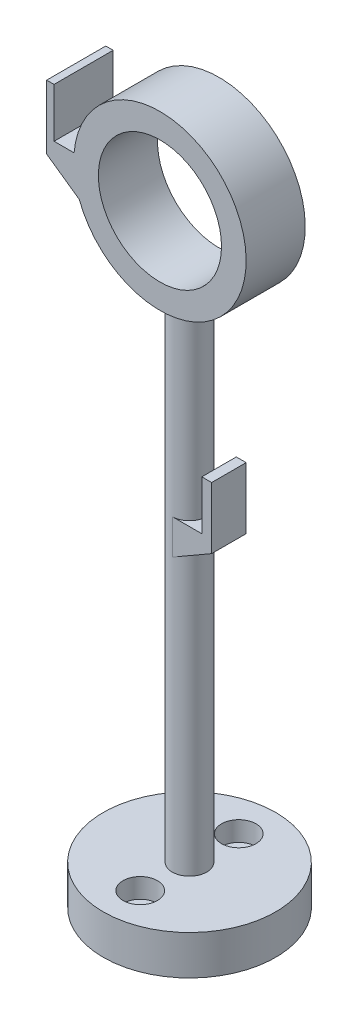
ISO-10303-21;
HEADER;
FILE_DESCRIPTION(('STEP AP214'),'2;1');
FILE_NAME('part.step','',(''),(''),'','','');
FILE_SCHEMA(('AUTOMOTIVE_DESIGN { 1 0 10303 214 1 1 1 1 }'));
ENDSEC;
DATA;
#1=APPLICATION_CONTEXT('core data for automotive mechanical design processes');
#2=APPLICATION_PROTOCOL_DEFINITION('international standard','automotive_design',2000,#1);
#3=PRODUCT_CONTEXT('',#1,'mechanical');
#4=PRODUCT('Part','Part','',(#3));
#5=PRODUCT_RELATED_PRODUCT_CATEGORY('part','',(#4));
#6=PRODUCT_DEFINITION_FORMATION('','',#4);
#7=PRODUCT_DEFINITION_CONTEXT('part definition',#1,'design');
#8=PRODUCT_DEFINITION('design','',#6,#7);
#9=PRODUCT_DEFINITION_SHAPE('','',#8);
#10=(LENGTH_UNIT() NAMED_UNIT(*) SI_UNIT(.MILLI.,.METRE.));
#11=(NAMED_UNIT(*) PLANE_ANGLE_UNIT() SI_UNIT($,.RADIAN.));
#12=(NAMED_UNIT(*) SI_UNIT($,.STERADIAN.) SOLID_ANGLE_UNIT());
#13=UNCERTAINTY_MEASURE_WITH_UNIT(LENGTH_MEASURE(1.E-05),#10,'distance_accuracy_value','');
#14=(GEOMETRIC_REPRESENTATION_CONTEXT(3) GLOBAL_UNCERTAINTY_ASSIGNED_CONTEXT((#13)) GLOBAL_UNIT_ASSIGNED_CONTEXT((#10,
#11,#12)) REPRESENTATION_CONTEXT('',''));
#15=CARTESIAN_POINT('',(0.,0.,0.));
#16=DIRECTION('',(0.,0.,1.));
#17=DIRECTION('',(1.,0.,0.));
#18=AXIS2_PLACEMENT_3D('',#15,#16,#17);
#19=CARTESIAN_POINT('',(0.,125.5,6.));
#20=DIRECTION('',(0.,0.,-1.));
#21=DIRECTION('',(-1.,0.,0.));
#22=AXIS2_PLACEMENT_3D('',#19,#20,#21);
#23=CYLINDRICAL_SURFACE('',#22,17.5);
#24=DIRECTION('',(0.,0.,-1.));
#25=VECTOR('',#24,1.);
#26=CARTESIAN_POINT('',(-16.3785413024095,119.33612258353,6.));
#27=LINE('',#26,#25);
#28=CARTESIAN_POINT('',(-16.3785413024095,119.33612258353,6.));
#29=VERTEX_POINT('',#28);
#30=CARTESIAN_POINT('',(-16.3785413024095,119.33612258353,-6.));
#31=VERTEX_POINT('',#30);
#32=EDGE_CURVE('E104',#29,#31,#27,.T.);
#33=ORIENTED_EDGE('',*,*,#32,.T.);
#34=CARTESIAN_POINT('',(0.,125.5,-6.));
#35=DIRECTION('',(0.,0.,1.));
#36=DIRECTION('',(1.,0.,0.));
#37=AXIS2_PLACEMENT_3D('',#34,#35,#36);
#38=CIRCLE('',#37,17.5);
#39=CARTESIAN_POINT('',(-17.4355957741627,127.,-6.));
#40=VERTEX_POINT('',#39);
#41=EDGE_CURVE('E57',#31,#40,#38,.T.);
#42=ORIENTED_EDGE('',*,*,#41,.T.);
#43=DIRECTION('',(0.,0.,-1.));
#44=VECTOR('',#43,1.);
#45=CARTESIAN_POINT('',(-17.4355957741627,127.,6.));
#46=LINE('',#45,#44);
#47=CARTESIAN_POINT('',(-17.4355957741627,127.,6.));
#48=VERTEX_POINT('',#47);
#49=EDGE_CURVE('E12',#48,#40,#46,.T.);
#50=ORIENTED_EDGE('',*,*,#49,.F.);
#51=CARTESIAN_POINT('',(0.,125.5,6.));
#52=DIRECTION('',(0.,0.,1.));
#53=DIRECTION('',(1.,0.,0.));
#54=AXIS2_PLACEMENT_3D('',#51,#52,#53);
#55=CIRCLE('',#54,17.5);
#56=EDGE_CURVE('E50',#29,#48,#55,.T.);
#57=ORIENTED_EDGE('',*,*,#56,.F.);
#58=EDGE_LOOP('',(#33,#42,#50,#57));
#59=FACE_BOUND('',#58,.T.);
#60=ADVANCED_FACE('F43',(#59),#23,.T.);
#61=CARTESIAN_POINT('',(-23.,127.,-6.00000000000016));
#62=DIRECTION('',(0.,-1.,0.));
#63=DIRECTION('',(0.,0.,-1.));
#64=AXIS2_PLACEMENT_3D('',#61,#62,#63);
#65=PLANE('',#64);
#66=DIRECTION('',(0.,0.,-1.));
#67=VECTOR('',#66,1.);
#68=CARTESIAN_POINT('',(-21.5,127.,-6.00000000000016));
#69=LINE('',#68,#67);
#70=CARTESIAN_POINT('',(-21.5,127.,5.99999999999984));
#71=VERTEX_POINT('',#70);
#72=CARTESIAN_POINT('',(-21.5,127.,-6.00000000000016));
#73=VERTEX_POINT('',#72);
#74=EDGE_CURVE('E108',#71,#73,#69,.T.);
#75=ORIENTED_EDGE('',*,*,#74,.F.);
#76=DIRECTION('',(1.,0.,0.));
#77=VECTOR('',#76,1.);
#78=CARTESIAN_POINT('',(-23.,127.,5.99999999999984));
#79=LINE('',#78,#77);
#80=EDGE_CURVE('E116',#71,#48,#79,.T.);
#81=ORIENTED_EDGE('',*,*,#80,.T.);
#82=ORIENTED_EDGE('',*,*,#49,.T.);
#83=DIRECTION('',(1.,0.,0.));
#84=VECTOR('',#83,1.);
#85=CARTESIAN_POINT('',(-23.,127.,-6.00000000000016));
#86=LINE('',#85,#84);
#87=EDGE_CURVE('E120',#73,#40,#86,.T.);
#88=ORIENTED_EDGE('',*,*,#87,.F.);
#89=EDGE_LOOP('',(#75,#81,#82,#88));
#90=FACE_BOUND('',#89,.T.);
#91=ADVANCED_FACE('F161',(#90),#65,.F.);
#92=CARTESIAN_POINT('',(0.,125.5,6.));
#93=DIRECTION('',(0.,0.,1.));
#94=DIRECTION('',(1.,0.,0.));
#95=AXIS2_PLACEMENT_3D('',#92,#93,#94);
#96=PLANE('',#95);
#97=DIRECTION('',(0.817554583090469,-0.575851112413416,0.));
#98=VECTOR('',#97,1.);
#99=CARTESIAN_POINT('',(-23.,124.,6.));
#100=LINE('',#99,#98);
#101=CARTESIAN_POINT('',(-23.,124.,5.99999999999984));
#102=VERTEX_POINT('',#101);
#103=EDGE_CURVE('E95',#102,#29,#100,.T.);
#104=ORIENTED_EDGE('',*,*,#103,.T.);
#105=ORIENTED_EDGE('',*,*,#56,.T.);
#106=ORIENTED_EDGE('',*,*,#80,.F.);
#107=DIRECTION('',(0.,-1.,0.));
#108=VECTOR('',#107,1.);
#109=CARTESIAN_POINT('',(-21.5,137.,5.99999999999984));
#110=LINE('',#109,#108);
#111=CARTESIAN_POINT('',(-21.5,137.,5.99999999999984));
#112=VERTEX_POINT('',#111);
#113=EDGE_CURVE('E128',#112,#71,#110,.T.);
#114=ORIENTED_EDGE('',*,*,#113,.F.);
#115=DIRECTION('',(1.,0.,0.));
#116=VECTOR('',#115,1.);
#117=CARTESIAN_POINT('',(-23.,137.,5.99999999999984));
#118=LINE('',#117,#116);
#119=CARTESIAN_POINT('',(-23.,137.,5.99999999999984));
#120=VERTEX_POINT('',#119);
#121=EDGE_CURVE('E140',#120,#112,#118,.T.);
#122=ORIENTED_EDGE('',*,*,#121,.F.);
#123=DIRECTION('',(0.,1.,0.));
#124=VECTOR('',#123,1.);
#125=CARTESIAN_POINT('',(-23.,125.5,5.99999999999984));
#126=LINE('',#125,#124);
#127=EDGE_CURVE('E100',#102,#120,#126,.T.);
#128=ORIENTED_EDGE('',*,*,#127,.F.);
#129=EDGE_LOOP('',(#104,#105,#106,#114,#122,#128));
#130=FACE_BOUND('',#129,.T.);
#131=CARTESIAN_POINT('',(0.,125.5,6.));
#132=DIRECTION('',(0.,0.,1.));
#133=DIRECTION('',(1.,0.,0.));
#134=AXIS2_PLACEMENT_3D('',#131,#132,#133);
#135=CIRCLE('',#134,12.5);
#136=CARTESIAN_POINT('',(12.5,125.5,6.));
#137=VERTEX_POINT('',#136);
#138=EDGE_CURVE('E111',#137,#137,#135,.T.);
#139=ORIENTED_EDGE('',*,*,#138,.F.);
#140=EDGE_LOOP('',(#139));
#141=FACE_BOUND('',#140,.T.);
#142=ADVANCED_FACE('F97',(#130,#141),#96,.T.);
#143=CARTESIAN_POINT('',(0.,125.5,-6.));
#144=DIRECTION('',(0.,0.,1.));
#145=DIRECTION('',(1.,0.,0.));
#146=AXIS2_PLACEMENT_3D('',#143,#144,#145);
#147=PLANE('',#146);
#148=ORIENTED_EDGE('',*,*,#41,.F.);
#149=DIRECTION('',(0.817554583090469,-0.575851112413416,0.));
#150=VECTOR('',#149,1.);
#151=CARTESIAN_POINT('',(-23.,124.,-6.));
#152=LINE('',#151,#150);
#153=CARTESIAN_POINT('',(-23.,124.,-6.));
#154=VERTEX_POINT('',#153);
#155=EDGE_CURVE('E105',#154,#31,#152,.T.);
#156=ORIENTED_EDGE('',*,*,#155,.F.);
#157=DIRECTION('',(0.,-1.,0.));
#158=VECTOR('',#157,1.);
#159=CARTESIAN_POINT('',(-23.,124.,-6.00000000000016));
#160=LINE('',#159,#158);
#161=CARTESIAN_POINT('',(-23.,137.,-6.00000000000016));
#162=VERTEX_POINT('',#161);
#163=EDGE_CURVE('E124',#162,#154,#160,.T.);
#164=ORIENTED_EDGE('',*,*,#163,.F.);
#165=DIRECTION('',(-1.,0.,0.));
#166=VECTOR('',#165,1.);
#167=CARTESIAN_POINT('',(-23.,137.,-6.00000000000016));
#168=LINE('',#167,#166);
#169=CARTESIAN_POINT('',(-21.5,137.,-6.00000000000016));
#170=VERTEX_POINT('',#169);
#171=EDGE_CURVE('E133',#170,#162,#168,.T.);
#172=ORIENTED_EDGE('',*,*,#171,.F.);
#173=DIRECTION('',(0.,-1.,0.));
#174=VECTOR('',#173,1.);
#175=CARTESIAN_POINT('',(-21.5,137.,-6.00000000000016));
#176=LINE('',#175,#174);
#177=EDGE_CURVE('E130',#170,#73,#176,.T.);
#178=ORIENTED_EDGE('',*,*,#177,.T.);
#179=ORIENTED_EDGE('',*,*,#87,.T.);
#180=EDGE_LOOP('',(#148,#156,#164,#172,#178,#179));
#181=FACE_BOUND('',#180,.T.);
#182=CARTESIAN_POINT('',(0.,125.5,-6.));
#183=DIRECTION('',(0.,0.,1.));
#184=DIRECTION('',(1.,0.,0.));
#185=AXIS2_PLACEMENT_3D('',#182,#183,#184);
#186=CIRCLE('',#185,12.5);
#187=CARTESIAN_POINT('',(12.5,125.5,-6.));
#188=VERTEX_POINT('',#187);
#189=EDGE_CURVE('E113',#188,#188,#186,.T.);
#190=ORIENTED_EDGE('',*,*,#189,.T.);
#191=EDGE_LOOP('',(#190));
#192=FACE_BOUND('',#191,.T.);
#193=ADVANCED_FACE('F158',(#181,#192),#147,.F.);
#194=CARTESIAN_POINT('',(0.,125.5,6.));
#195=DIRECTION('',(0.,0.,-1.));
#196=DIRECTION('',(-1.,0.,0.));
#197=AXIS2_PLACEMENT_3D('',#194,#195,#196);
#198=CYLINDRICAL_SURFACE('',#197,12.5);
#199=ORIENTED_EDGE('',*,*,#138,.T.);
#200=EDGE_LOOP('',(#199));
#201=FACE_BOUND('',#200,.T.);
#202=ORIENTED_EDGE('',*,*,#189,.F.);
#203=EDGE_LOOP('',(#202));
#204=FACE_BOUND('',#203,.T.);
#205=ADVANCED_FACE('F172',(#201,#204),#198,.F.);
#206=CARTESIAN_POINT('',(-23.,0.,-1.59947109980099E-13));
#207=DIRECTION('',(1.,0.,0.));
#208=DIRECTION('',(0.,0.,-1.));
#209=AXIS2_PLACEMENT_3D('',#206,#207,#208);
#210=PLANE('',#209);
#211=ORIENTED_EDGE('',*,*,#127,.T.);
#212=DIRECTION('',(0.,0.,1.));
#213=VECTOR('',#212,1.);
#214=CARTESIAN_POINT('',(-23.,137.,-6.00000000000016));
#215=LINE('',#214,#213);
#216=EDGE_CURVE('E135',#162,#120,#215,.T.);
#217=ORIENTED_EDGE('',*,*,#216,.F.);
#218=ORIENTED_EDGE('',*,*,#163,.T.);
#219=DIRECTION('',(0.,0.,1.));
#220=VECTOR('',#219,1.);
#221=CARTESIAN_POINT('',(-23.,124.,5.99999999999984));
#222=LINE('',#221,#220);
#223=EDGE_CURVE('E122',#154,#102,#222,.T.);
#224=ORIENTED_EDGE('',*,*,#223,.T.);
#225=EDGE_LOOP('',(#211,#217,#218,#224));
#226=FACE_BOUND('',#225,.T.);
#227=ADVANCED_FACE('F150',(#226),#210,.F.);
#228=CARTESIAN_POINT('',(-21.5,137.,-6.00000000000016));
#229=DIRECTION('',(-1.,0.,0.));
#230=DIRECTION('',(0.,0.,1.));
#231=AXIS2_PLACEMENT_3D('',#228,#229,#230);
#232=PLANE('',#231);
#233=ORIENTED_EDGE('',*,*,#74,.T.);
#234=ORIENTED_EDGE('',*,*,#177,.F.);
#235=DIRECTION('',(0.,0.,-1.));
#236=VECTOR('',#235,1.);
#237=CARTESIAN_POINT('',(-21.5,137.,-6.00000000000016));
#238=LINE('',#237,#236);
#239=EDGE_CURVE('E138',#112,#170,#238,.T.);
#240=ORIENTED_EDGE('',*,*,#239,.F.);
#241=ORIENTED_EDGE('',*,*,#113,.T.);
#242=EDGE_LOOP('',(#233,#234,#240,#241));
#243=FACE_BOUND('',#242,.T.);
#244=ADVANCED_FACE('F155',(#243),#232,.F.);
#245=CARTESIAN_POINT('',(0.,137.,0.));
#246=DIRECTION('',(0.,1.,0.));
#247=DIRECTION('',(0.,0.,1.));
#248=AXIS2_PLACEMENT_3D('',#245,#246,#247);
#249=PLANE('',#248);
#250=ORIENTED_EDGE('',*,*,#216,.T.);
#251=ORIENTED_EDGE('',*,*,#121,.T.);
#252=ORIENTED_EDGE('',*,*,#239,.T.);
#253=ORIENTED_EDGE('',*,*,#171,.T.);
#254=EDGE_LOOP('',(#250,#251,#252,#253));
#255=FACE_BOUND('',#254,.T.);
#256=ADVANCED_FACE('F146',(#255),#249,.T.);
#257=CARTESIAN_POINT('',(-23.,124.,6.));
#258=DIRECTION('',(0.575851112413416,0.817554583090469,0.));
#259=DIRECTION('',(-0.817554583090469,0.575851112413416,0.));
#260=AXIS2_PLACEMENT_3D('',#257,#258,#259);
#261=PLANE('',#260);
#262=ORIENTED_EDGE('',*,*,#155,.T.);
#263=ORIENTED_EDGE('',*,*,#32,.F.);
#264=ORIENTED_EDGE('',*,*,#103,.F.);
#265=ORIENTED_EDGE('',*,*,#223,.F.);
#266=EDGE_LOOP('',(#262,#263,#264,#265));
#267=FACE_BOUND('',#266,.T.);
#268=ADVANCED_FACE('F107',(#267),#261,.F.);
#269=CLOSED_SHELL('',(#60,#91,#142,#193,#205,#227,#244,#256,#268));
#270=MANIFOLD_SOLID_BREP('B2',#269);
#271=CARTESIAN_POINT('',(0.,108.,0.));
#272=DIRECTION('',(0.,-1.,0.));
#273=DIRECTION('',(0.,0.,-1.));
#274=AXIS2_PLACEMENT_3D('',#271,#272,#273);
#275=CYLINDRICAL_SURFACE('',#274,3.5);
#276=CARTESIAN_POINT('',(0.,108.,0.));
#277=DIRECTION('',(0.,1.,0.));
#278=DIRECTION('',(0.,0.,1.));
#279=AXIS2_PLACEMENT_3D('',#276,#277,#278);
#280=CIRCLE('',#279,3.5);
#281=CARTESIAN_POINT('',(0.,108.,3.5));
#282=VERTEX_POINT('',#281);
#283=EDGE_CURVE('E376',#282,#282,#280,.T.);
#284=ORIENTED_EDGE('',*,*,#283,.F.);
#285=EDGE_LOOP('',(#284));
#286=FACE_BOUND('',#285,.T.);
#287=CARTESIAN_POINT('',(0.,8.,0.));
#288=DIRECTION('',(0.,1.,0.));
#289=DIRECTION('',(0.,0.,1.));
#290=AXIS2_PLACEMENT_3D('',#287,#288,#289);
#291=CIRCLE('',#290,3.5);
#292=CARTESIAN_POINT('',(0.,8.,3.5));
#293=VERTEX_POINT('',#292);
#294=EDGE_CURVE('E272',#293,#293,#291,.T.);
#295=ORIENTED_EDGE('',*,*,#294,.T.);
#296=EDGE_LOOP('',(#295));
#297=FACE_BOUND('',#296,.T.);
#298=CARTESIAN_POINT('',(0.,63.381197846483,0.));
#299=DIRECTION('',(-0.500000000000001,0.866025403784438,0.));
#300=DIRECTION('',(-0.866025403784438,-0.500000000000001,0.));
#301=AXIS2_PLACEMENT_3D('',#298,#299,#300);
#302=ELLIPSE('',#301,4.04145188432738,3.5);
#303=CARTESIAN_POINT('',(0.,63.381197846483,3.5));
#304=VERTEX_POINT('',#303);
#305=CARTESIAN_POINT('',(0.,63.381197846483,-3.5));
#306=VERTEX_POINT('',#305);
#307=EDGE_CURVE('E328',#304,#306,#302,.T.);
#308=ORIENTED_EDGE('',*,*,#307,.F.);
#309=DIRECTION('',(0.,-1.,0.));
#310=VECTOR('',#309,1.);
#311=CARTESIAN_POINT('',(0.,68.,3.5));
#312=LINE('',#311,#310);
#313=CARTESIAN_POINT('',(0.,70.5,3.5));
#314=VERTEX_POINT('',#313);
#315=EDGE_CURVE('E317',#314,#304,#312,.T.);
#316=ORIENTED_EDGE('',*,*,#315,.F.);
#317=CARTESIAN_POINT('',(0.,70.5,0.));
#318=DIRECTION('',(0.,-1.,0.));
#319=DIRECTION('',(0.,0.,-1.));
#320=AXIS2_PLACEMENT_3D('',#317,#318,#319);
#321=CIRCLE('',#320,3.5);
#322=CARTESIAN_POINT('',(0.,70.5,-3.5));
#323=VERTEX_POINT('',#322);
#324=EDGE_CURVE('E41',#323,#314,#321,.T.);
#325=ORIENTED_EDGE('',*,*,#324,.F.);
#326=DIRECTION('',(0.,1.,0.));
#327=VECTOR('',#326,1.);
#328=CARTESIAN_POINT('',(0.,70.5,-3.5));
#329=LINE('',#328,#327);
#330=EDGE_CURVE('E324',#306,#323,#329,.T.);
#331=ORIENTED_EDGE('',*,*,#330,.F.);
#332=EDGE_LOOP('',(#308,#316,#325,#331));
#333=FACE_BOUND('',#332,.T.);
#334=ADVANCED_FACE('F264',(#286,#297,#333),#275,.T.);
#335=CARTESIAN_POINT('',(8.,70.5,3.50000000000002));
#336=DIRECTION('',(0.,-1.,0.));
#337=DIRECTION('',(0.,0.,-1.));
#338=AXIS2_PLACEMENT_3D('',#335,#336,#337);
#339=PLANE('',#338);
#340=DIRECTION('',(0.,0.,1.));
#341=VECTOR('',#340,1.);
#342=CARTESIAN_POINT('',(6.,70.5,3.50000000000004));
#343=LINE('',#342,#341);
#344=CARTESIAN_POINT('',(6.,70.5,-3.5));
#345=VERTEX_POINT('',#344);
#346=CARTESIAN_POINT('',(6.,70.5,3.50000000000004));
#347=VERTEX_POINT('',#346);
#348=EDGE_CURVE('E333',#345,#347,#343,.T.);
#349=ORIENTED_EDGE('',*,*,#348,.F.);
#350=DIRECTION('',(-1.,0.,0.));
#351=VECTOR('',#350,1.);
#352=CARTESIAN_POINT('',(8.,70.5,-3.5));
#353=LINE('',#352,#351);
#354=EDGE_CURVE('E358',#345,#323,#353,.T.);
#355=ORIENTED_EDGE('',*,*,#354,.T.);
#356=ORIENTED_EDGE('',*,*,#324,.T.);
#357=DIRECTION('',(-1.,0.,0.));
#358=VECTOR('',#357,1.);
#359=CARTESIAN_POINT('',(8.,70.5,3.50000000000002));
#360=LINE('',#359,#358);
#361=EDGE_CURVE('E279',#347,#314,#360,.T.);
#362=ORIENTED_EDGE('',*,*,#361,.F.);
#363=EDGE_LOOP('',(#349,#355,#356,#362));
#364=FACE_BOUND('',#363,.T.);
#365=ADVANCED_FACE('F412',(#364),#339,.F.);
#366=CARTESIAN_POINT('',(0.,8.,0.));
#367=DIRECTION('',(0.,-1.,0.));
#368=DIRECTION('',(0.,0.,-1.));
#369=AXIS2_PLACEMENT_3D('',#366,#367,#368);
#370=CYLINDRICAL_SURFACE('',#369,17.5);
#371=CARTESIAN_POINT('',(0.,8.,0.));
#372=DIRECTION('',(0.,1.,0.));
#373=DIRECTION('',(0.,0.,1.));
#374=AXIS2_PLACEMENT_3D('',#371,#372,#373);
#375=CIRCLE('',#374,17.5);
#376=CARTESIAN_POINT('',(0.,8.,17.5));
#377=VERTEX_POINT('',#376);
#378=EDGE_CURVE('E390',#377,#377,#375,.T.);
#379=ORIENTED_EDGE('',*,*,#378,.F.);
#380=EDGE_LOOP('',(#379));
#381=FACE_BOUND('',#380,.T.);
#382=CARTESIAN_POINT('',(0.,0.,0.));
#383=DIRECTION('',(0.,1.,0.));
#384=DIRECTION('',(0.,0.,1.));
#385=AXIS2_PLACEMENT_3D('',#382,#383,#384);
#386=CIRCLE('',#385,17.5);
#387=CARTESIAN_POINT('',(0.,0.,17.5));
#388=VERTEX_POINT('',#387);
#389=EDGE_CURVE('E387',#388,#388,#386,.T.);
#390=ORIENTED_EDGE('',*,*,#389,.T.);
#391=EDGE_LOOP('',(#390));
#392=FACE_BOUND('',#391,.T.);
#393=ADVANCED_FACE('F266',(#381,#392),#370,.T.);
#394=CARTESIAN_POINT('',(0.,8.,0.));
#395=DIRECTION('',(0.,1.,0.));
#396=DIRECTION('',(0.,0.,1.));
#397=AXIS2_PLACEMENT_3D('',#394,#395,#396);
#398=PLANE('',#397);
#399=CARTESIAN_POINT('',(0.,8.,-10.));
#400=DIRECTION('',(0.,1.,0.));
#401=DIRECTION('',(0.,0.,1.));
#402=AXIS2_PLACEMENT_3D('',#399,#400,#401);
#403=CIRCLE('',#402,3.5);
#404=CARTESIAN_POINT('',(0.,8.,-6.5));
#405=VERTEX_POINT('',#404);
#406=EDGE_CURVE('E377',#405,#405,#403,.T.);
#407=ORIENTED_EDGE('',*,*,#406,.F.);
#408=EDGE_LOOP('',(#407));
#409=FACE_BOUND('',#408,.T.);
#410=CARTESIAN_POINT('',(0.,8.,10.));
#411=DIRECTION('',(0.,1.,0.));
#412=DIRECTION('',(0.,0.,1.));
#413=AXIS2_PLACEMENT_3D('',#410,#411,#412);
#414=CIRCLE('',#413,3.5);
#415=CARTESIAN_POINT('',(0.,8.,13.5));
#416=VERTEX_POINT('',#415);
#417=EDGE_CURVE('E364',#416,#416,#414,.T.);
#418=ORIENTED_EDGE('',*,*,#417,.F.);
#419=EDGE_LOOP('',(#418));
#420=FACE_BOUND('',#419,.T.);
#421=ORIENTED_EDGE('',*,*,#294,.F.);
#422=EDGE_LOOP('',(#421));
#423=FACE_BOUND('',#422,.T.);
#424=ORIENTED_EDGE('',*,*,#378,.T.);
#425=EDGE_LOOP('',(#424));
#426=FACE_BOUND('',#425,.T.);
#427=ADVANCED_FACE('F399',(#409,#420,#423,#426),#398,.T.);
#428=CARTESIAN_POINT('',(0.,0.,0.));
#429=DIRECTION('',(0.,1.,0.));
#430=DIRECTION('',(0.,0.,1.));
#431=AXIS2_PLACEMENT_3D('',#428,#429,#430);
#432=PLANE('',#431);
#433=CARTESIAN_POINT('',(0.,0.,-10.));
#434=DIRECTION('',(0.,1.,0.));
#435=DIRECTION('',(0.,0.,1.));
#436=AXIS2_PLACEMENT_3D('',#433,#434,#435);
#437=CIRCLE('',#436,2.);
#438=CARTESIAN_POINT('',(0.,0.,-8.));
#439=VERTEX_POINT('',#438);
#440=EDGE_CURVE('E361',#439,#439,#437,.T.);
#441=ORIENTED_EDGE('',*,*,#440,.T.);
#442=EDGE_LOOP('',(#441));
#443=FACE_BOUND('',#442,.T.);
#444=CARTESIAN_POINT('',(0.,0.,10.));
#445=DIRECTION('',(0.,1.,0.));
#446=DIRECTION('',(0.,0.,1.));
#447=AXIS2_PLACEMENT_3D('',#444,#445,#446);
#448=CIRCLE('',#447,2.);
#449=CARTESIAN_POINT('',(0.,0.,12.));
#450=VERTEX_POINT('',#449);
#451=EDGE_CURVE('E368',#450,#450,#448,.T.);
#452=ORIENTED_EDGE('',*,*,#451,.T.);
#453=EDGE_LOOP('',(#452));
#454=FACE_BOUND('',#453,.T.);
#455=ORIENTED_EDGE('',*,*,#389,.F.);
#456=EDGE_LOOP('',(#455));
#457=FACE_BOUND('',#456,.T.);
#458=ADVANCED_FACE('F396',(#443,#454,#457),#432,.F.);
#459=CARTESIAN_POINT('',(0.,108.,0.));
#460=DIRECTION('',(0.,1.,0.));
#461=DIRECTION('',(0.,0.,1.));
#462=AXIS2_PLACEMENT_3D('',#459,#460,#461);
#463=PLANE('',#462);
#464=ORIENTED_EDGE('',*,*,#283,.T.);
#465=EDGE_LOOP('',(#464));
#466=FACE_BOUND('',#465,.T.);
#467=ADVANCED_FACE('F398',(#466),#463,.T.);
#468=CARTESIAN_POINT('',(0.,4.,10.));
#469=DIRECTION('',(0.,1.,0.));
#470=DIRECTION('',(0.,0.,1.));
#471=AXIS2_PLACEMENT_3D('',#468,#469,#470);
#472=CYLINDRICAL_SURFACE('',#471,3.5);
#473=CARTESIAN_POINT('',(0.,4.,10.));
#474=DIRECTION('',(0.,1.,0.));
#475=DIRECTION('',(0.,0.,1.));
#476=AXIS2_PLACEMENT_3D('',#473,#474,#475);
#477=CIRCLE('',#476,3.5);
#478=CARTESIAN_POINT('',(0.,4.,13.5));
#479=VERTEX_POINT('',#478);
#480=EDGE_CURVE('E380',#479,#479,#477,.T.);
#481=ORIENTED_EDGE('',*,*,#480,.F.);
#482=EDGE_LOOP('',(#481));
#483=FACE_BOUND('',#482,.T.);
#484=ORIENTED_EDGE('',*,*,#417,.T.);
#485=EDGE_LOOP('',(#484));
#486=FACE_BOUND('',#485,.T.);
#487=ADVANCED_FACE('F405',(#483,#486),#472,.F.);
#488=CARTESIAN_POINT('',(0.,4.,10.));
#489=DIRECTION('',(0.,1.,0.));
#490=DIRECTION('',(0.,0.,1.));
#491=AXIS2_PLACEMENT_3D('',#488,#489,#490);
#492=PLANE('',#491);
#493=CARTESIAN_POINT('',(0.,4.,10.));
#494=DIRECTION('',(0.,1.,0.));
#495=DIRECTION('',(0.,0.,1.));
#496=AXIS2_PLACEMENT_3D('',#493,#494,#495);
#497=CIRCLE('',#496,2.);
#498=CARTESIAN_POINT('',(0.,4.,12.));
#499=VERTEX_POINT('',#498);
#500=EDGE_CURVE('E360',#499,#499,#497,.T.);
#501=ORIENTED_EDGE('',*,*,#500,.F.);
#502=EDGE_LOOP('',(#501));
#503=FACE_BOUND('',#502,.T.);
#504=ORIENTED_EDGE('',*,*,#480,.T.);
#505=EDGE_LOOP('',(#504));
#506=FACE_BOUND('',#505,.T.);
#507=ADVANCED_FACE('F425',(#503,#506),#492,.T.);
#508=CARTESIAN_POINT('',(0.,4.,-10.));
#509=DIRECTION('',(0.,1.,0.));
#510=DIRECTION('',(0.,0.,1.));
#511=AXIS2_PLACEMENT_3D('',#508,#509,#510);
#512=CYLINDRICAL_SURFACE('',#511,3.5);
#513=CARTESIAN_POINT('',(0.,4.,-10.));
#514=DIRECTION('',(0.,1.,0.));
#515=DIRECTION('',(0.,0.,1.));
#516=AXIS2_PLACEMENT_3D('',#513,#514,#515);
#517=CIRCLE('',#516,3.5);
#518=CARTESIAN_POINT('',(0.,4.,-6.5));
#519=VERTEX_POINT('',#518);
#520=EDGE_CURVE('E373',#519,#519,#517,.T.);
#521=ORIENTED_EDGE('',*,*,#520,.F.);
#522=EDGE_LOOP('',(#521));
#523=FACE_BOUND('',#522,.T.);
#524=ORIENTED_EDGE('',*,*,#406,.T.);
#525=EDGE_LOOP('',(#524));
#526=FACE_BOUND('',#525,.T.);
#527=ADVANCED_FACE('F429',(#523,#526),#512,.F.);
#528=CARTESIAN_POINT('',(0.,4.,-10.));
#529=DIRECTION('',(0.,1.,0.));
#530=DIRECTION('',(0.,0.,1.));
#531=AXIS2_PLACEMENT_3D('',#528,#529,#530);
#532=PLANE('',#531);
#533=CARTESIAN_POINT('',(0.,4.,-10.));
#534=DIRECTION('',(0.,1.,0.));
#535=DIRECTION('',(0.,0.,1.));
#536=AXIS2_PLACEMENT_3D('',#533,#534,#535);
#537=CIRCLE('',#536,2.);
#538=CARTESIAN_POINT('',(0.,4.,-8.));
#539=VERTEX_POINT('',#538);
#540=EDGE_CURVE('E365',#539,#539,#537,.T.);
#541=ORIENTED_EDGE('',*,*,#540,.F.);
#542=EDGE_LOOP('',(#541));
#543=FACE_BOUND('',#542,.T.);
#544=ORIENTED_EDGE('',*,*,#520,.T.);
#545=EDGE_LOOP('',(#544));
#546=FACE_BOUND('',#545,.T.);
#547=ADVANCED_FACE('F433',(#543,#546),#532,.T.);
#548=CARTESIAN_POINT('',(0.,0.,10.));
#549=DIRECTION('',(0.,1.,0.));
#550=DIRECTION('',(0.,0.,1.));
#551=AXIS2_PLACEMENT_3D('',#548,#549,#550);
#552=CYLINDRICAL_SURFACE('',#551,2.);
#553=ORIENTED_EDGE('',*,*,#451,.F.);
#554=EDGE_LOOP('',(#553));
#555=FACE_BOUND('',#554,.T.);
#556=ORIENTED_EDGE('',*,*,#500,.T.);
#557=EDGE_LOOP('',(#556));
#558=FACE_BOUND('',#557,.T.);
#559=ADVANCED_FACE('F437',(#555,#558),#552,.F.);
#560=CARTESIAN_POINT('',(0.,0.,-10.));
#561=DIRECTION('',(0.,1.,0.));
#562=DIRECTION('',(0.,0.,1.));
#563=AXIS2_PLACEMENT_3D('',#560,#561,#562);
#564=CYLINDRICAL_SURFACE('',#563,2.);
#565=ORIENTED_EDGE('',*,*,#440,.F.);
#566=EDGE_LOOP('',(#565));
#567=FACE_BOUND('',#566,.T.);
#568=ORIENTED_EDGE('',*,*,#540,.T.);
#569=EDGE_LOOP('',(#568));
#570=FACE_BOUND('',#569,.T.);
#571=ADVANCED_FACE('F441',(#567,#570),#564,.F.);
#572=CARTESIAN_POINT('',(8.,68.,3.5));
#573=DIRECTION('',(0.,0.,-1.));
#574=DIRECTION('',(0.,1.,0.));
#575=AXIS2_PLACEMENT_3D('',#572,#573,#574);
#576=PLANE('',#575);
#577=ORIENTED_EDGE('',*,*,#315,.T.);
#578=DIRECTION('',(0.866025403784438,0.500000000000001,0.));
#579=VECTOR('',#578,1.);
#580=CARTESIAN_POINT('',(8.,68.,3.5));
#581=LINE('',#580,#579);
#582=CARTESIAN_POINT('',(8.,68.,3.5));
#583=VERTEX_POINT('',#582);
#584=EDGE_CURVE('E320',#304,#583,#581,.T.);
#585=ORIENTED_EDGE('',*,*,#584,.T.);
#586=DIRECTION('',(0.,-1.,0.));
#587=VECTOR('',#586,1.);
#588=CARTESIAN_POINT('',(8.,68.,3.5));
#589=LINE('',#588,#587);
#590=CARTESIAN_POINT('',(8.,80.5,3.50000000000004));
#591=VERTEX_POINT('',#590);
#592=EDGE_CURVE('E351',#591,#583,#589,.T.);
#593=ORIENTED_EDGE('',*,*,#592,.F.);
#594=DIRECTION('',(1.,0.,0.));
#595=VECTOR('',#594,1.);
#596=CARTESIAN_POINT('',(8.,80.5,3.50000000000004));
#597=LINE('',#596,#595);
#598=CARTESIAN_POINT('',(6.,80.5,3.50000000000004));
#599=VERTEX_POINT('',#598);
#600=EDGE_CURVE('E345',#599,#591,#597,.T.);
#601=ORIENTED_EDGE('',*,*,#600,.F.);
#602=DIRECTION('',(0.,-1.,0.));
#603=VECTOR('',#602,1.);
#604=CARTESIAN_POINT('',(6.,80.5,3.50000000000004));
#605=LINE('',#604,#603);
#606=EDGE_CURVE('E347',#599,#347,#605,.T.);
#607=ORIENTED_EDGE('',*,*,#606,.T.);
#608=ORIENTED_EDGE('',*,*,#361,.T.);
#609=EDGE_LOOP('',(#577,#585,#593,#601,#607,#608));
#610=FACE_BOUND('',#609,.T.);
#611=ADVANCED_FACE('F319',(#610),#576,.F.);
#612=CARTESIAN_POINT('',(8.,70.5,-3.5));
#613=DIRECTION('',(0.,0.,1.));
#614=DIRECTION('',(1.,0.,0.));
#615=AXIS2_PLACEMENT_3D('',#612,#613,#614);
#616=PLANE('',#615);
#617=ORIENTED_EDGE('',*,*,#330,.T.);
#618=ORIENTED_EDGE('',*,*,#354,.F.);
#619=DIRECTION('',(0.,-1.,0.));
#620=VECTOR('',#619,1.);
#621=CARTESIAN_POINT('',(6.,80.5,-3.5));
#622=LINE('',#621,#620);
#623=CARTESIAN_POINT('',(6.,80.5,-3.5));
#624=VERTEX_POINT('',#623);
#625=EDGE_CURVE('E325',#624,#345,#622,.T.);
#626=ORIENTED_EDGE('',*,*,#625,.F.);
#627=DIRECTION('',(-1.,0.,0.));
#628=VECTOR('',#627,1.);
#629=CARTESIAN_POINT('',(6.,80.5,-3.5));
#630=LINE('',#629,#628);
#631=CARTESIAN_POINT('',(8.,80.5,-3.5));
#632=VERTEX_POINT('',#631);
#633=EDGE_CURVE('E341',#632,#624,#630,.T.);
#634=ORIENTED_EDGE('',*,*,#633,.F.);
#635=DIRECTION('',(0.,1.,0.));
#636=VECTOR('',#635,1.);
#637=CARTESIAN_POINT('',(8.,70.5,-3.5));
#638=LINE('',#637,#636);
#639=CARTESIAN_POINT('',(8.,68.,-3.5));
#640=VERTEX_POINT('',#639);
#641=EDGE_CURVE('E354',#640,#632,#638,.T.);
#642=ORIENTED_EDGE('',*,*,#641,.F.);
#643=DIRECTION('',(0.866025403784438,0.500000000000001,0.));
#644=VECTOR('',#643,1.);
#645=CARTESIAN_POINT('',(8.,68.,-3.5));
#646=LINE('',#645,#644);
#647=EDGE_CURVE('E287',#306,#640,#646,.T.);
#648=ORIENTED_EDGE('',*,*,#647,.F.);
#649=EDGE_LOOP('',(#617,#618,#626,#634,#642,#648));
#650=FACE_BOUND('',#649,.T.);
#651=ADVANCED_FACE('F448',(#650),#616,.F.);
#652=CARTESIAN_POINT('',(8.,0.,0.));
#653=DIRECTION('',(-1.,0.,0.));
#654=DIRECTION('',(0.,0.,1.));
#655=AXIS2_PLACEMENT_3D('',#652,#653,#654);
#656=PLANE('',#655);
#657=ORIENTED_EDGE('',*,*,#592,.T.);
#658=DIRECTION('',(0.,0.,-1.));
#659=VECTOR('',#658,1.);
#660=CARTESIAN_POINT('',(8.,68.,-3.5));
#661=LINE('',#660,#659);
#662=EDGE_CURVE('E329',#583,#640,#661,.T.);
#663=ORIENTED_EDGE('',*,*,#662,.T.);
#664=ORIENTED_EDGE('',*,*,#641,.T.);
#665=DIRECTION('',(0.,0.,-1.));
#666=VECTOR('',#665,1.);
#667=CARTESIAN_POINT('',(8.,80.5,-3.5));
#668=LINE('',#667,#666);
#669=EDGE_CURVE('E335',#591,#632,#668,.T.);
#670=ORIENTED_EDGE('',*,*,#669,.F.);
#671=EDGE_LOOP('',(#657,#663,#664,#670));
#672=FACE_BOUND('',#671,.T.);
#673=ADVANCED_FACE('F450',(#672),#656,.F.);
#674=CARTESIAN_POINT('',(6.,80.5,3.50000000000004));
#675=DIRECTION('',(1.,0.,0.));
#676=DIRECTION('',(0.,0.,-1.));
#677=AXIS2_PLACEMENT_3D('',#674,#675,#676);
#678=PLANE('',#677);
#679=ORIENTED_EDGE('',*,*,#348,.T.);
#680=ORIENTED_EDGE('',*,*,#606,.F.);
#681=DIRECTION('',(0.,0.,1.));
#682=VECTOR('',#681,1.);
#683=CARTESIAN_POINT('',(6.,80.5,3.50000000000004));
#684=LINE('',#683,#682);
#685=EDGE_CURVE('E343',#624,#599,#684,.T.);
#686=ORIENTED_EDGE('',*,*,#685,.F.);
#687=ORIENTED_EDGE('',*,*,#625,.T.);
#688=EDGE_LOOP('',(#679,#680,#686,#687));
#689=FACE_BOUND('',#688,.T.);
#690=ADVANCED_FACE('F455',(#689),#678,.F.);
#691=CARTESIAN_POINT('',(0.,80.5,0.));
#692=DIRECTION('',(0.,-1.,0.));
#693=DIRECTION('',(0.,0.,-1.));
#694=AXIS2_PLACEMENT_3D('',#691,#692,#693);
#695=PLANE('',#694);
#696=ORIENTED_EDGE('',*,*,#669,.T.);
#697=ORIENTED_EDGE('',*,*,#633,.T.);
#698=ORIENTED_EDGE('',*,*,#685,.T.);
#699=ORIENTED_EDGE('',*,*,#600,.T.);
#700=EDGE_LOOP('',(#696,#697,#698,#699));
#701=FACE_BOUND('',#700,.T.);
#702=ADVANCED_FACE('F459',(#701),#695,.F.);
#703=CARTESIAN_POINT('',(8.,68.,3.5));
#704=DIRECTION('',(-0.500000000000001,0.866025403784438,0.));
#705=DIRECTION('',(-0.866025403784438,-0.500000000000001,0.));
#706=AXIS2_PLACEMENT_3D('',#703,#704,#705);
#707=PLANE('',#706);
#708=ORIENTED_EDGE('',*,*,#584,.F.);
#709=ORIENTED_EDGE('',*,*,#307,.T.);
#710=ORIENTED_EDGE('',*,*,#647,.T.);
#711=ORIENTED_EDGE('',*,*,#662,.F.);
#712=EDGE_LOOP('',(#708,#709,#710,#711));
#713=FACE_BOUND('',#712,.T.);
#714=ADVANCED_FACE('F327',(#713),#707,.F.);
#715=CLOSED_SHELL('',(#334,#365,#393,#427,#458,#467,#487,#507,#527,#547,#559,#571,#611,#651,
#673,#690,#702,#714));
#716=MANIFOLD_SOLID_BREP('B6',#715);
#717=ADVANCED_BREP_SHAPE_REPRESENTATION('',(#18,#270,#716),#14);
#718=SHAPE_DEFINITION_REPRESENTATION(#9,#717);
ENDSEC;
END-ISO-10303-21;
